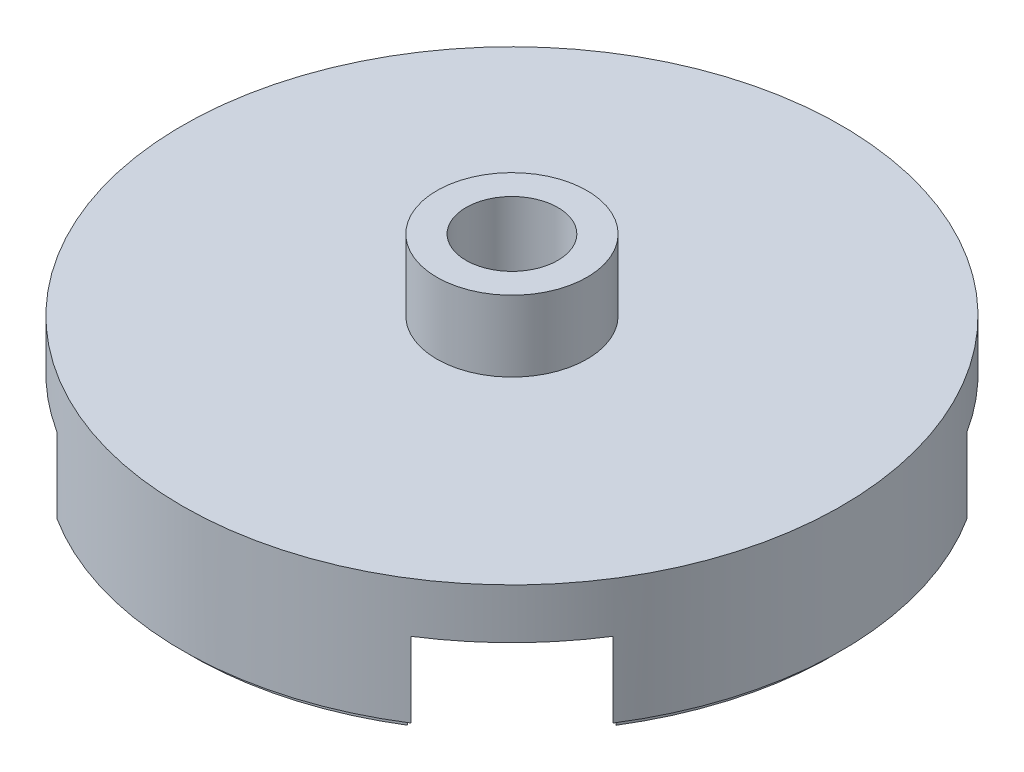
ISO-10303-21;
HEADER;
FILE_DESCRIPTION(('STEP AP214'),'2;1');
FILE_NAME('part.step','',(''),(''),'','','');
FILE_SCHEMA(('AUTOMOTIVE_DESIGN { 1 0 10303 214 1 1 1 1 }'));
ENDSEC;
DATA;
#1=APPLICATION_CONTEXT('core data for automotive mechanical design processes');
#2=APPLICATION_PROTOCOL_DEFINITION('international standard','automotive_design',2000,#1);
#3=PRODUCT_CONTEXT('',#1,'mechanical');
#4=PRODUCT('Part','Part','',(#3));
#5=PRODUCT_RELATED_PRODUCT_CATEGORY('part','',(#4));
#6=PRODUCT_DEFINITION_FORMATION('','',#4);
#7=PRODUCT_DEFINITION_CONTEXT('part definition',#1,'design');
#8=PRODUCT_DEFINITION('design','',#6,#7);
#9=PRODUCT_DEFINITION_SHAPE('','',#8);
#10=(LENGTH_UNIT() NAMED_UNIT(*) SI_UNIT(.MILLI.,.METRE.));
#11=(NAMED_UNIT(*) PLANE_ANGLE_UNIT() SI_UNIT($,.RADIAN.));
#12=(NAMED_UNIT(*) SI_UNIT($,.STERADIAN.) SOLID_ANGLE_UNIT());
#13=UNCERTAINTY_MEASURE_WITH_UNIT(LENGTH_MEASURE(1.E-05),#10,'distance_accuracy_value','');
#14=(GEOMETRIC_REPRESENTATION_CONTEXT(3) GLOBAL_UNCERTAINTY_ASSIGNED_CONTEXT((#13)) GLOBAL_UNIT_ASSIGNED_CONTEXT((#10,
#11,#12)) REPRESENTATION_CONTEXT('',''));
#15=CARTESIAN_POINT('',(0.,0.,0.));
#16=DIRECTION('',(0.,0.,1.));
#17=DIRECTION('',(1.,0.,0.));
#18=AXIS2_PLACEMENT_3D('',#15,#16,#17);
#19=CARTESIAN_POINT('',(0.,0.,0.));
#20=DIRECTION('',(0.,1.,0.));
#21=DIRECTION('',(0.,0.,1.));
#22=AXIS2_PLACEMENT_3D('',#19,#20,#21);
#23=PLANE('',#22);
#24=DIRECTION('',(-0.506190088583315,0.,-0.862421935145446));
#25=VECTOR('',#24,1.);
#26=CARTESIAN_POINT('',(6.66279242192183,0.,4.24466690593985));
#27=LINE('',#26,#25);
#28=CARTESIAN_POINT('',(6.66279242192183,0.,4.24466690593985));
#29=VERTEX_POINT('',#28);
#30=CARTESIAN_POINT('',(5.90350728904686,0.,2.95103400322168));
#31=VERTEX_POINT('',#30);
#32=EDGE_CURVE('E225',#29,#31,#27,.T.);
#33=ORIENTED_EDGE('',*,*,#32,.F.);
#34=CARTESIAN_POINT('',(0.,0.,0.));
#35=DIRECTION('',(0.,1.,0.));
#36=DIRECTION('',(0.,0.,1.));
#37=AXIS2_PLACEMENT_3D('',#34,#35,#36);
#38=CIRCLE('',#37,7.9);
#39=CARTESIAN_POINT('',(4.24466690593992,0.,6.66279242192179));
#40=VERTEX_POINT('',#39);
#41=EDGE_CURVE('E750',#40,#29,#38,.T.);
#42=ORIENTED_EDGE('',*,*,#41,.F.);
#43=DIRECTION('',(0.862421935145451,0.,0.506190088583306));
#44=VECTOR('',#43,1.);
#45=CARTESIAN_POINT('',(4.24466690593992,0.,6.66279242192179));
#46=LINE('',#45,#44);
#47=CARTESIAN_POINT('',(2.95103400322174,0.,5.90350728904683));
#48=VERTEX_POINT('',#47);
#49=EDGE_CURVE('E288',#48,#40,#46,.T.);
#50=ORIENTED_EDGE('',*,*,#49,.F.);
#51=CARTESIAN_POINT('',(0.,0.,0.));
#52=DIRECTION('',(0.,1.,0.));
#53=DIRECTION('',(0.,0.,-1.));
#54=AXIS2_PLACEMENT_3D('',#51,#52,#53);
#55=CIRCLE('',#54,6.6);
#56=CARTESIAN_POINT('',(-2.95103400322174,0.,5.90350728904683));
#57=VERTEX_POINT('',#56);
#58=EDGE_CURVE('E295',#57,#48,#55,.T.);
#59=ORIENTED_EDGE('',*,*,#58,.F.);
#60=DIRECTION('',(0.862421935145451,0.,-0.506190088583306));
#61=VECTOR('',#60,1.);
#62=CARTESIAN_POINT('',(-4.24466690593992,0.,6.66279242192179));
#63=LINE('',#62,#61);
#64=CARTESIAN_POINT('',(-4.24466690593992,0.,6.66279242192179));
#65=VERTEX_POINT('',#64);
#66=EDGE_CURVE('E284',#65,#57,#63,.T.);
#67=ORIENTED_EDGE('',*,*,#66,.F.);
#68=CARTESIAN_POINT('',(-6.66279242192178,0.,4.24466690593994));
#69=VERTEX_POINT('',#68);
#70=EDGE_CURVE('E385',#69,#65,#38,.T.);
#71=ORIENTED_EDGE('',*,*,#70,.F.);
#72=DIRECTION('',(-0.506190088583303,0.,0.862421935145453));
#73=VECTOR('',#72,1.);
#74=CARTESIAN_POINT('',(-6.66279242192178,0.,4.24466690593994));
#75=LINE('',#74,#73);
#76=CARTESIAN_POINT('',(-5.90350728904682,0.,2.95103400322176));
#77=VERTEX_POINT('',#76);
#78=EDGE_CURVE('E312',#77,#69,#75,.T.);
#79=ORIENTED_EDGE('',*,*,#78,.F.);
#80=CARTESIAN_POINT('',(0.,0.,0.));
#81=DIRECTION('',(0.,1.,0.));
#82=DIRECTION('',(1.,0.,0.));
#83=AXIS2_PLACEMENT_3D('',#80,#81,#82);
#84=CIRCLE('',#83,6.6);
#85=CARTESIAN_POINT('',(-5.90350728904684,0.,-2.95103400322172));
#86=VERTEX_POINT('',#85);
#87=EDGE_CURVE('E317',#86,#77,#84,.T.);
#88=ORIENTED_EDGE('',*,*,#87,.F.);
#89=DIRECTION('',(0.506190088583309,0.,0.86242193514545));
#90=VECTOR('',#89,1.);
#91=CARTESIAN_POINT('',(-6.6627924219218,0.,-4.24466690593989));
#92=LINE('',#91,#90);
#93=CARTESIAN_POINT('',(-6.6627924219218,0.,-4.24466690593989));
#94=VERTEX_POINT('',#93);
#95=EDGE_CURVE('E308',#94,#86,#92,.T.);
#96=ORIENTED_EDGE('',*,*,#95,.F.);
#97=CARTESIAN_POINT('',(-4.24466690593992,0.,-6.66279242192179));
#98=VERTEX_POINT('',#97);
#99=EDGE_CURVE('E383',#98,#94,#38,.T.);
#100=ORIENTED_EDGE('',*,*,#99,.F.);
#101=DIRECTION('',(-0.862421935145451,0.,-0.506190088583306));
#102=VECTOR('',#101,1.);
#103=CARTESIAN_POINT('',(-4.24466690593992,0.,-6.66279242192179));
#104=LINE('',#103,#102);
#105=CARTESIAN_POINT('',(-2.95103400322174,0.,-5.90350728904683));
#106=VERTEX_POINT('',#105);
#107=EDGE_CURVE('E350',#106,#98,#104,.T.);
#108=ORIENTED_EDGE('',*,*,#107,.F.);
#109=CARTESIAN_POINT('',(0.,0.,0.));
#110=DIRECTION('',(0.,1.,0.));
#111=DIRECTION('',(0.,0.,1.));
#112=AXIS2_PLACEMENT_3D('',#109,#110,#111);
#113=CIRCLE('',#112,6.6);
#114=CARTESIAN_POINT('',(2.95103400322174,0.,-5.90350728904683));
#115=VERTEX_POINT('',#114);
#116=EDGE_CURVE('E358',#115,#106,#113,.T.);
#117=ORIENTED_EDGE('',*,*,#116,.F.);
#118=DIRECTION('',(-0.862421935145451,0.,0.506190088583306));
#119=VECTOR('',#118,1.);
#120=CARTESIAN_POINT('',(4.24466690593992,0.,-6.66279242192179));
#121=LINE('',#120,#119);
#122=CARTESIAN_POINT('',(4.24466690593992,0.,-6.66279242192179));
#123=VERTEX_POINT('',#122);
#124=EDGE_CURVE('E344',#123,#115,#121,.T.);
#125=ORIENTED_EDGE('',*,*,#124,.F.);
#126=CARTESIAN_POINT('',(6.66279242192175,0.,-4.24466690593999));
#127=VERTEX_POINT('',#126);
#128=EDGE_CURVE('E377',#127,#123,#38,.T.);
#129=ORIENTED_EDGE('',*,*,#128,.F.);
#130=DIRECTION('',(0.506190088583297,0.,-0.862421935145457));
#131=VECTOR('',#130,1.);
#132=CARTESIAN_POINT('',(6.66279242192175,0.,-4.24466690593999));
#133=LINE('',#132,#131);
#134=CARTESIAN_POINT('',(5.9035072890468,0.,-2.9510340032218));
#135=VERTEX_POINT('',#134);
#136=EDGE_CURVE('E264',#135,#127,#133,.T.);
#137=ORIENTED_EDGE('',*,*,#136,.F.);
#138=CARTESIAN_POINT('',(0.,0.,0.));
#139=DIRECTION('',(0.,1.,0.));
#140=DIRECTION('',(-1.,0.,0.));
#141=AXIS2_PLACEMENT_3D('',#138,#139,#140);
#142=CIRCLE('',#141,6.6);
#143=EDGE_CURVE('E271',#31,#135,#142,.T.);
#144=ORIENTED_EDGE('',*,*,#143,.F.);
#145=EDGE_LOOP('',(#33,#42,#50,#59,#67,#71,#79,#88,#96,#100,#108,#117,#125,#129,#137,#144));
#146=FACE_BOUND('',#145,.T.);
#147=CARTESIAN_POINT('',(0.,0.,0.));
#148=DIRECTION('',(0.,1.,0.));
#149=DIRECTION('',(0.,0.,1.));
#150=AXIS2_PLACEMENT_3D('',#147,#148,#149);
#151=CIRCLE('',#150,1.7);
#152=CARTESIAN_POINT('',(0.,0.,1.7));
#153=VERTEX_POINT('',#152);
#154=EDGE_CURVE('E11',#153,#153,#151,.F.);
#155=ORIENTED_EDGE('',*,*,#154,.F.);
#156=EDGE_LOOP('',(#155));
#157=FACE_BOUND('',#156,.T.);
#158=ADVANCED_FACE('F37',(#146,#157),#23,.F.);
#159=CARTESIAN_POINT('',(0.,1.2,0.));
#160=DIRECTION('',(0.,-1.,0.));
#161=DIRECTION('',(0.,0.,-1.));
#162=AXIS2_PLACEMENT_3D('',#159,#160,#161);
#163=CYLINDRICAL_SURFACE('',#162,7.9);
#164=CARTESIAN_POINT('',(0.,1.2,0.));
#165=DIRECTION('',(0.,1.,0.));
#166=DIRECTION('',(0.,0.,1.));
#167=AXIS2_PLACEMENT_3D('',#164,#165,#166);
#168=CIRCLE('',#167,7.9);
#169=CARTESIAN_POINT('',(0.,1.2,7.9));
#170=VERTEX_POINT('',#169);
#171=EDGE_CURVE('E380',#170,#170,#168,.T.);
#172=ORIENTED_EDGE('',*,*,#171,.F.);
#173=EDGE_LOOP('',(#172));
#174=FACE_BOUND('',#173,.T.);
#175=DIRECTION('',(0.,1.,0.));
#176=VECTOR('',#175,1.);
#177=CARTESIAN_POINT('',(-6.6627924219218,-2.,-4.24466690593989));
#178=LINE('',#177,#176);
#179=CARTESIAN_POINT('',(-6.6627924219218,-1.8,-4.2446669059399));
#180=VERTEX_POINT('',#179);
#181=EDGE_CURVE('E327',#180,#94,#178,.T.);
#182=ORIENTED_EDGE('',*,*,#181,.F.);
#183=CARTESIAN_POINT('',(0.,-1.8,0.));
#184=DIRECTION('',(0.,-1.,0.));
#185=DIRECTION('',(-1.,0.,0.));
#186=AXIS2_PLACEMENT_3D('',#183,#184,#185);
#187=CIRCLE('',#186,7.9);
#188=CARTESIAN_POINT('',(-6.66279242192177,-1.8,4.24466690593995));
#189=VERTEX_POINT('',#188);
#190=EDGE_CURVE('E218',#189,#180,#187,.T.);
#191=ORIENTED_EDGE('',*,*,#190,.F.);
#192=DIRECTION('',(0.,1.,0.));
#193=VECTOR('',#192,1.);
#194=CARTESIAN_POINT('',(-6.66279242192178,-2.,4.24466690593994));
#195=LINE('',#194,#193);
#196=EDGE_CURVE('E217',#189,#69,#195,.T.);
#197=ORIENTED_EDGE('',*,*,#196,.T.);
#198=ORIENTED_EDGE('',*,*,#70,.T.);
#199=DIRECTION('',(0.,1.,0.));
#200=VECTOR('',#199,1.);
#201=CARTESIAN_POINT('',(-4.24466690593992,-2.,6.66279242192179));
#202=LINE('',#201,#200);
#203=CARTESIAN_POINT('',(-4.24466690593992,-1.8,6.66279242192179));
#204=VERTEX_POINT('',#203);
#205=EDGE_CURVE('E306',#204,#65,#202,.T.);
#206=ORIENTED_EDGE('',*,*,#205,.F.);
#207=CARTESIAN_POINT('',(0.,-1.8,0.));
#208=DIRECTION('',(0.,-1.,0.));
#209=DIRECTION('',(0.,0.,1.));
#210=AXIS2_PLACEMENT_3D('',#207,#208,#209);
#211=CIRCLE('',#210,7.9);
#212=CARTESIAN_POINT('',(4.24466690593992,-1.8,6.66279242192179));
#213=VERTEX_POINT('',#212);
#214=EDGE_CURVE('E233',#213,#204,#211,.T.);
#215=ORIENTED_EDGE('',*,*,#214,.F.);
#216=DIRECTION('',(0.,1.,0.));
#217=VECTOR('',#216,1.);
#218=CARTESIAN_POINT('',(4.24466690593992,-2.,6.66279242192179));
#219=LINE('',#218,#217);
#220=EDGE_CURVE('E293',#213,#40,#219,.T.);
#221=ORIENTED_EDGE('',*,*,#220,.T.);
#222=ORIENTED_EDGE('',*,*,#41,.T.);
#223=DIRECTION('',(0.,1.,0.));
#224=VECTOR('',#223,1.);
#225=CARTESIAN_POINT('',(6.66279242192183,-2.,4.24466690593985));
#226=LINE('',#225,#224);
#227=CARTESIAN_POINT('',(6.66279242192183,-1.8,4.24466690593985));
#228=VERTEX_POINT('',#227);
#229=EDGE_CURVE('E282',#228,#29,#226,.T.);
#230=ORIENTED_EDGE('',*,*,#229,.F.);
#231=CARTESIAN_POINT('',(0.,-1.8,0.));
#232=DIRECTION('',(0.,-1.,0.));
#233=DIRECTION('',(1.,0.,0.));
#234=AXIS2_PLACEMENT_3D('',#231,#232,#233);
#235=CIRCLE('',#234,7.9);
#236=CARTESIAN_POINT('',(6.66279242192174,-1.8,-4.24466690593999));
#237=VERTEX_POINT('',#236);
#238=EDGE_CURVE('E250',#237,#228,#235,.T.);
#239=ORIENTED_EDGE('',*,*,#238,.F.);
#240=DIRECTION('',(0.,1.,0.));
#241=VECTOR('',#240,1.);
#242=CARTESIAN_POINT('',(6.66279242192175,-2.,-4.24466690593999));
#243=LINE('',#242,#241);
#244=EDGE_CURVE('E269',#237,#127,#243,.T.);
#245=ORIENTED_EDGE('',*,*,#244,.T.);
#246=ORIENTED_EDGE('',*,*,#128,.T.);
#247=DIRECTION('',(0.,1.,0.));
#248=VECTOR('',#247,1.);
#249=CARTESIAN_POINT('',(4.24466690593992,-2.,-6.66279242192179));
#250=LINE('',#249,#248);
#251=CARTESIAN_POINT('',(4.24466690593992,-1.8,-6.66279242192179));
#252=VERTEX_POINT('',#251);
#253=EDGE_CURVE('E370',#252,#123,#250,.T.);
#254=ORIENTED_EDGE('',*,*,#253,.F.);
#255=CARTESIAN_POINT('',(0.,-1.8,0.));
#256=DIRECTION('',(0.,-1.,0.));
#257=DIRECTION('',(0.,0.,-1.));
#258=AXIS2_PLACEMENT_3D('',#255,#256,#257);
#259=CIRCLE('',#258,7.9);
#260=CARTESIAN_POINT('',(-4.24466690593992,-1.8,-6.66279242192179));
#261=VERTEX_POINT('',#260);
#262=EDGE_CURVE('E335',#261,#252,#259,.T.);
#263=ORIENTED_EDGE('',*,*,#262,.F.);
#264=DIRECTION('',(0.,1.,0.));
#265=VECTOR('',#264,1.);
#266=CARTESIAN_POINT('',(-4.24466690593992,-2.,-6.66279242192179));
#267=LINE('',#266,#265);
#268=EDGE_CURVE('E355',#261,#98,#267,.T.);
#269=ORIENTED_EDGE('',*,*,#268,.T.);
#270=ORIENTED_EDGE('',*,*,#99,.T.);
#271=EDGE_LOOP('',(#182,#191,#197,#198,#206,#215,#221,#222,#230,#239,#245,#246,#254,#263,#269,#270));
#272=FACE_BOUND('',#271,.T.);
#273=ADVANCED_FACE('F39',(#174,#272),#163,.T.);
#274=CARTESIAN_POINT('',(0.,1.2,0.));
#275=DIRECTION('',(0.,1.,0.));
#276=DIRECTION('',(0.,0.,1.));
#277=AXIS2_PLACEMENT_3D('',#274,#275,#276);
#278=PLANE('',#277);
#279=CARTESIAN_POINT('',(0.,1.2,0.));
#280=DIRECTION('',(0.,1.,0.));
#281=DIRECTION('',(0.,0.,1.));
#282=AXIS2_PLACEMENT_3D('',#279,#280,#281);
#283=CIRCLE('',#282,1.8);
#284=CARTESIAN_POINT('',(0.,1.2,1.8));
#285=VERTEX_POINT('',#284);
#286=EDGE_CURVE('E45',#285,#285,#283,.T.);
#287=ORIENTED_EDGE('',*,*,#286,.F.);
#288=EDGE_LOOP('',(#287));
#289=FACE_BOUND('',#288,.T.);
#290=ORIENTED_EDGE('',*,*,#171,.T.);
#291=EDGE_LOOP('',(#290));
#292=FACE_BOUND('',#291,.T.);
#293=ADVANCED_FACE('F401',(#289,#292),#278,.T.);
#294=CARTESIAN_POINT('',(0.,2.9,0.));
#295=DIRECTION('',(0.,-1.,0.));
#296=DIRECTION('',(0.,0.,-1.));
#297=AXIS2_PLACEMENT_3D('',#294,#295,#296);
#298=CYLINDRICAL_SURFACE('',#297,1.8);
#299=CARTESIAN_POINT('',(0.,2.9,0.));
#300=DIRECTION('',(0.,1.,0.));
#301=DIRECTION('',(0.,0.,1.));
#302=AXIS2_PLACEMENT_3D('',#299,#300,#301);
#303=CIRCLE('',#302,1.8);
#304=CARTESIAN_POINT('',(0.,2.9,1.8));
#305=VERTEX_POINT('',#304);
#306=EDGE_CURVE('E374',#305,#305,#303,.T.);
#307=ORIENTED_EDGE('',*,*,#306,.F.);
#308=EDGE_LOOP('',(#307));
#309=FACE_BOUND('',#308,.T.);
#310=ORIENTED_EDGE('',*,*,#286,.T.);
#311=EDGE_LOOP('',(#310));
#312=FACE_BOUND('',#311,.T.);
#313=ADVANCED_FACE('F395',(#309,#312),#298,.T.);
#314=CARTESIAN_POINT('',(0.,2.9,0.));
#315=DIRECTION('',(0.,1.,0.));
#316=DIRECTION('',(0.,0.,1.));
#317=AXIS2_PLACEMENT_3D('',#314,#315,#316);
#318=PLANE('',#317);
#319=CARTESIAN_POINT('',(0.,2.9,0.));
#320=DIRECTION('',(0.,1.,0.));
#321=DIRECTION('',(0.,0.,1.));
#322=AXIS2_PLACEMENT_3D('',#319,#320,#321);
#323=CIRCLE('',#322,1.1);
#324=CARTESIAN_POINT('',(0.,2.9,1.1));
#325=VERTEX_POINT('',#324);
#326=EDGE_CURVE('E373',#325,#325,#323,.T.);
#327=ORIENTED_EDGE('',*,*,#326,.F.);
#328=EDGE_LOOP('',(#327));
#329=FACE_BOUND('',#328,.T.);
#330=ORIENTED_EDGE('',*,*,#306,.T.);
#331=EDGE_LOOP('',(#330));
#332=FACE_BOUND('',#331,.T.);
#333=ADVANCED_FACE('F392',(#329,#332),#318,.T.);
#334=CARTESIAN_POINT('',(0.,0.,0.));
#335=DIRECTION('',(0.,1.,0.));
#336=DIRECTION('',(0.,0.,1.));
#337=AXIS2_PLACEMENT_3D('',#334,#335,#336);
#338=CYLINDRICAL_SURFACE('',#337,1.1);
#339=ORIENTED_EDGE('',*,*,#326,.T.);
#340=EDGE_LOOP('',(#339));
#341=FACE_BOUND('',#340,.T.);
#342=CARTESIAN_POINT('',(0.,-2.,0.));
#343=DIRECTION('',(0.,-1.,0.));
#344=DIRECTION('',(0.,0.,-1.));
#345=AXIS2_PLACEMENT_3D('',#342,#343,#344);
#346=CIRCLE('',#345,1.1);
#347=CARTESIAN_POINT('',(0.,-2.,-1.1));
#348=VERTEX_POINT('',#347);
#349=EDGE_CURVE('E656',#348,#348,#346,.T.);
#350=ORIENTED_EDGE('',*,*,#349,.T.);
#351=EDGE_LOOP('',(#350));
#352=FACE_BOUND('',#351,.T.);
#353=ADVANCED_FACE('F389',(#341,#352),#338,.F.);
#354=CARTESIAN_POINT('',(4.24466690593992,-2.,-6.66279242192179));
#355=DIRECTION('',(-0.506190088583306,0.,-0.862421935145452));
#356=DIRECTION('',(-0.862421935145452,0.,0.506190088583306));
#357=AXIS2_PLACEMENT_3D('',#354,#355,#356);
#358=PLANE('',#357);
#359=DIRECTION('',(-0.862421935145451,0.,0.506190088583306));
#360=VECTOR('',#359,1.);
#361=CARTESIAN_POINT('',(4.24466690593992,-2.,-6.66279242192179));
#362=LINE('',#361,#360);
#363=CARTESIAN_POINT('',(4.05026569607206,-2.,-6.54869054019366));
#364=VERTEX_POINT('',#363);
#365=CARTESIAN_POINT('',(2.95103400322174,-2.,-5.90350728904683));
#366=VERTEX_POINT('',#365);
#367=EDGE_CURVE('E347',#364,#366,#362,.T.);
#368=ORIENTED_EDGE('',*,*,#367,.F.);
#369=DIRECTION('',(0.,-1.,0.));
#370=VECTOR('',#369,1.);
#371=CARTESIAN_POINT('',(4.05026569607206,-1.8,-6.54869054019366));
#372=LINE('',#371,#370);
#373=CARTESIAN_POINT('',(4.05026569607206,-1.8,-6.54869054019366));
#374=VERTEX_POINT('',#373);
#375=EDGE_CURVE('E342',#374,#364,#372,.T.);
#376=ORIENTED_EDGE('',*,*,#375,.F.);
#377=DIRECTION('',(-0.862421935145456,0.,0.506190088583297));
#378=VECTOR('',#377,1.);
#379=CARTESIAN_POINT('',(4.24466690593992,-1.8,-6.66279242192179));
#380=LINE('',#379,#378);
#381=EDGE_CURVE('E337',#252,#374,#380,.T.);
#382=ORIENTED_EDGE('',*,*,#381,.F.);
#383=ORIENTED_EDGE('',*,*,#253,.T.);
#384=ORIENTED_EDGE('',*,*,#124,.T.);
#385=DIRECTION('',(0.,1.,0.));
#386=VECTOR('',#385,1.);
#387=CARTESIAN_POINT('',(2.95103400322174,-2.,-5.90350728904683));
#388=LINE('',#387,#386);
#389=EDGE_CURVE('E367',#366,#115,#388,.T.);
#390=ORIENTED_EDGE('',*,*,#389,.F.);
#391=EDGE_LOOP('',(#368,#376,#382,#383,#384,#390));
#392=FACE_BOUND('',#391,.T.);
#393=ADVANCED_FACE('F448',(#392),#358,.F.);
#394=CARTESIAN_POINT('',(0.,-2.,0.));
#395=DIRECTION('',(0.,1.,0.));
#396=DIRECTION('',(0.,0.,1.));
#397=AXIS2_PLACEMENT_3D('',#394,#395,#396);
#398=CYLINDRICAL_SURFACE('',#397,6.6);
#399=ORIENTED_EDGE('',*,*,#116,.T.);
#400=DIRECTION('',(0.,1.,0.));
#401=VECTOR('',#400,1.);
#402=CARTESIAN_POINT('',(-2.95103400322174,-2.,-5.90350728904683));
#403=LINE('',#402,#401);
#404=CARTESIAN_POINT('',(-2.95103400322174,-2.,-5.90350728904683));
#405=VERTEX_POINT('',#404);
#406=EDGE_CURVE('E364',#405,#106,#403,.T.);
#407=ORIENTED_EDGE('',*,*,#406,.F.);
#408=CARTESIAN_POINT('',(0.,-2.,0.));
#409=DIRECTION('',(0.,1.,0.));
#410=DIRECTION('',(0.,0.,1.));
#411=AXIS2_PLACEMENT_3D('',#408,#409,#410);
#412=CIRCLE('',#411,6.6);
#413=EDGE_CURVE('E349',#366,#405,#412,.T.);
#414=ORIENTED_EDGE('',*,*,#413,.F.);
#415=ORIENTED_EDGE('',*,*,#389,.T.);
#416=EDGE_LOOP('',(#399,#407,#414,#415));
#417=FACE_BOUND('',#416,.T.);
#418=ADVANCED_FACE('F451',(#417),#398,.F.);
#419=CARTESIAN_POINT('',(-4.24466690593992,-2.,-6.66279242192179));
#420=DIRECTION('',(0.506190088583306,0.,-0.862421935145452));
#421=DIRECTION('',(-0.862421935145452,0.,-0.506190088583306));
#422=AXIS2_PLACEMENT_3D('',#419,#420,#421);
#423=PLANE('',#422);
#424=DIRECTION('',(-0.862421935145465,0.,-0.506190088583283));
#425=VECTOR('',#424,1.);
#426=CARTESIAN_POINT('',(-4.05026569607206,-1.8,-6.54869054019366));
#427=LINE('',#426,#425);
#428=CARTESIAN_POINT('',(-4.05026569607206,-1.8,-6.54869054019366));
#429=VERTEX_POINT('',#428);
#430=EDGE_CURVE('E333',#429,#261,#427,.T.);
#431=ORIENTED_EDGE('',*,*,#430,.F.);
#432=DIRECTION('',(0.,-1.,0.));
#433=VECTOR('',#432,1.);
#434=CARTESIAN_POINT('',(-4.05026569607206,-1.8,-6.54869054019366));
#435=LINE('',#434,#433);
#436=CARTESIAN_POINT('',(-4.05026569607206,-2.,-6.54869054019366));
#437=VERTEX_POINT('',#436);
#438=EDGE_CURVE('E340',#429,#437,#435,.T.);
#439=ORIENTED_EDGE('',*,*,#438,.T.);
#440=DIRECTION('',(-0.862421935145451,0.,-0.506190088583306));
#441=VECTOR('',#440,1.);
#442=CARTESIAN_POINT('',(-4.24466690593992,-2.,-6.66279242192179));
#443=LINE('',#442,#441);
#444=EDGE_CURVE('E352',#405,#437,#443,.T.);
#445=ORIENTED_EDGE('',*,*,#444,.F.);
#446=ORIENTED_EDGE('',*,*,#406,.T.);
#447=ORIENTED_EDGE('',*,*,#107,.T.);
#448=ORIENTED_EDGE('',*,*,#268,.F.);
#449=EDGE_LOOP('',(#431,#439,#445,#446,#447,#448));
#450=FACE_BOUND('',#449,.T.);
#451=ADVANCED_FACE('F455',(#450),#423,.F.);
#452=CARTESIAN_POINT('',(0.,-2.,0.));
#453=DIRECTION('',(0.,1.,0.));
#454=DIRECTION('',(0.,0.,1.));
#455=AXIS2_PLACEMENT_3D('',#452,#453,#454);
#456=PLANE('',#455);
#457=ORIENTED_EDGE('',*,*,#444,.T.);
#458=CARTESIAN_POINT('',(0.,-2.,0.));
#459=DIRECTION('',(0.,1.,0.));
#460=DIRECTION('',(0.,0.,1.));
#461=AXIS2_PLACEMENT_3D('',#458,#459,#460);
#462=CIRCLE('',#461,7.7);
#463=EDGE_CURVE('E329',#364,#437,#462,.T.);
#464=ORIENTED_EDGE('',*,*,#463,.F.);
#465=ORIENTED_EDGE('',*,*,#367,.T.);
#466=ORIENTED_EDGE('',*,*,#413,.T.);
#467=EDGE_LOOP('',(#457,#464,#465,#466));
#468=FACE_BOUND('',#467,.T.);
#469=ADVANCED_FACE('F459',(#468),#456,.F.);
#470=CARTESIAN_POINT('',(0.,-1.8,0.));
#471=DIRECTION('',(0.,-1.,0.));
#472=DIRECTION('',(0.,0.,-1.));
#473=AXIS2_PLACEMENT_3D('',#470,#471,#472);
#474=CYLINDRICAL_SURFACE('',#473,7.7);
#475=ORIENTED_EDGE('',*,*,#463,.T.);
#476=ORIENTED_EDGE('',*,*,#438,.F.);
#477=CARTESIAN_POINT('',(0.,-1.8,0.));
#478=DIRECTION('',(0.,1.,0.));
#479=DIRECTION('',(0.,0.,1.));
#480=AXIS2_PLACEMENT_3D('',#477,#478,#479);
#481=CIRCLE('',#480,7.7);
#482=EDGE_CURVE('E330',#374,#429,#481,.T.);
#483=ORIENTED_EDGE('',*,*,#482,.F.);
#484=ORIENTED_EDGE('',*,*,#375,.T.);
#485=EDGE_LOOP('',(#475,#476,#483,#484));
#486=FACE_BOUND('',#485,.T.);
#487=ADVANCED_FACE('F463',(#486),#474,.T.);
#488=CARTESIAN_POINT('',(0.,-1.8,0.));
#489=DIRECTION('',(0.,1.,0.));
#490=DIRECTION('',(0.,0.,1.));
#491=AXIS2_PLACEMENT_3D('',#488,#489,#490);
#492=PLANE('',#491);
#493=ORIENTED_EDGE('',*,*,#482,.T.);
#494=ORIENTED_EDGE('',*,*,#430,.T.);
#495=ORIENTED_EDGE('',*,*,#262,.T.);
#496=ORIENTED_EDGE('',*,*,#381,.T.);
#497=EDGE_LOOP('',(#493,#494,#495,#496));
#498=FACE_BOUND('',#497,.T.);
#499=ADVANCED_FACE('F467',(#498),#492,.F.);
#500=CARTESIAN_POINT('',(-6.6627924219218,-2.,-4.24466690593989));
#501=DIRECTION('',(-0.86242193514545,0.,0.506190088583309));
#502=DIRECTION('',(0.506190088583309,0.,0.86242193514545));
#503=AXIS2_PLACEMENT_3D('',#500,#501,#502);
#504=PLANE('',#503);
#505=DIRECTION('',(0.506190088583309,0.,0.86242193514545));
#506=VECTOR('',#505,1.);
#507=CARTESIAN_POINT('',(-6.6627924219218,-2.,-4.24466690593989));
#508=LINE('',#507,#506);
#509=CARTESIAN_POINT('',(-6.54869054019367,-2.,-4.05026569607204));
#510=VERTEX_POINT('',#509);
#511=CARTESIAN_POINT('',(-5.90350728904684,-2.,-2.95103400322172));
#512=VERTEX_POINT('',#511);
#513=EDGE_CURVE('E309',#510,#512,#508,.T.);
#514=ORIENTED_EDGE('',*,*,#513,.F.);
#515=DIRECTION('',(0.,-1.,0.));
#516=VECTOR('',#515,1.);
#517=CARTESIAN_POINT('',(-6.54869054019367,-1.8,-4.05026569607204));
#518=LINE('',#517,#516);
#519=CARTESIAN_POINT('',(-6.54869054019367,-1.8,-4.05026569607204));
#520=VERTEX_POINT('',#519);
#521=EDGE_CURVE('E52',#520,#510,#518,.T.);
#522=ORIENTED_EDGE('',*,*,#521,.F.);
#523=DIRECTION('',(0.5061900885833,0.,0.862421935145455));
#524=VECTOR('',#523,1.);
#525=CARTESIAN_POINT('',(-6.6627924219218,-1.8,-4.2446669059399));
#526=LINE('',#525,#524);
#527=EDGE_CURVE('E206',#180,#520,#526,.T.);
#528=ORIENTED_EDGE('',*,*,#527,.F.);
#529=ORIENTED_EDGE('',*,*,#181,.T.);
#530=ORIENTED_EDGE('',*,*,#95,.T.);
#531=DIRECTION('',(0.,1.,0.));
#532=VECTOR('',#531,1.);
#533=CARTESIAN_POINT('',(-5.90350728904684,-2.,-2.95103400322172));
#534=LINE('',#533,#532);
#535=EDGE_CURVE('E324',#512,#86,#534,.T.);
#536=ORIENTED_EDGE('',*,*,#535,.F.);
#537=EDGE_LOOP('',(#514,#522,#528,#529,#530,#536));
#538=FACE_BOUND('',#537,.T.);
#539=ADVANCED_FACE('F417',(#538),#504,.F.);
#540=CARTESIAN_POINT('',(0.,-2.,0.));
#541=DIRECTION('',(0.,1.,0.));
#542=DIRECTION('',(0.,0.,1.));
#543=AXIS2_PLACEMENT_3D('',#540,#541,#542);
#544=CYLINDRICAL_SURFACE('',#543,6.6);
#545=ORIENTED_EDGE('',*,*,#87,.T.);
#546=DIRECTION('',(0.,1.,0.));
#547=VECTOR('',#546,1.);
#548=CARTESIAN_POINT('',(-5.90350728904682,-2.,2.95103400322176));
#549=LINE('',#548,#547);
#550=CARTESIAN_POINT('',(-5.90350728904682,-2.,2.95103400322176));
#551=VERTEX_POINT('',#550);
#552=EDGE_CURVE('E321',#551,#77,#549,.T.);
#553=ORIENTED_EDGE('',*,*,#552,.F.);
#554=CARTESIAN_POINT('',(0.,-2.,0.));
#555=DIRECTION('',(0.,1.,0.));
#556=DIRECTION('',(1.,0.,0.));
#557=AXIS2_PLACEMENT_3D('',#554,#555,#556);
#558=CIRCLE('',#557,6.6);
#559=EDGE_CURVE('E311',#512,#551,#558,.T.);
#560=ORIENTED_EDGE('',*,*,#559,.F.);
#561=ORIENTED_EDGE('',*,*,#535,.T.);
#562=EDGE_LOOP('',(#545,#553,#560,#561));
#563=FACE_BOUND('',#562,.T.);
#564=ADVANCED_FACE('F427',(#563),#544,.F.);
#565=CARTESIAN_POINT('',(-6.66279242192178,-2.,4.24466690593994));
#566=DIRECTION('',(-0.862421935145453,0.,-0.506190088583303));
#567=DIRECTION('',(-0.506190088583303,0.,0.862421935145453));
#568=AXIS2_PLACEMENT_3D('',#565,#566,#567);
#569=PLANE('',#568);
#570=DIRECTION('',(-0.50619008858328,0.,0.862421935145467));
#571=VECTOR('',#570,1.);
#572=CARTESIAN_POINT('',(-6.54869054019364,-1.8,4.05026569607208));
#573=LINE('',#572,#571);
#574=CARTESIAN_POINT('',(-6.54869054019364,-1.8,4.05026569607208));
#575=VERTEX_POINT('',#574);
#576=EDGE_CURVE('E210',#575,#189,#573,.T.);
#577=ORIENTED_EDGE('',*,*,#576,.F.);
#578=DIRECTION('',(0.,-1.,0.));
#579=VECTOR('',#578,1.);
#580=CARTESIAN_POINT('',(-6.54869054019364,-1.8,4.05026569607208));
#581=LINE('',#580,#579);
#582=CARTESIAN_POINT('',(-6.54869054019364,-2.,4.05026569607208));
#583=VERTEX_POINT('',#582);
#584=EDGE_CURVE('E196',#575,#583,#581,.T.);
#585=ORIENTED_EDGE('',*,*,#584,.T.);
#586=DIRECTION('',(-0.506190088583303,0.,0.862421935145453));
#587=VECTOR('',#586,1.);
#588=CARTESIAN_POINT('',(-6.66279242192178,-2.,4.24466690593994));
#589=LINE('',#588,#587);
#590=EDGE_CURVE('E314',#551,#583,#589,.T.);
#591=ORIENTED_EDGE('',*,*,#590,.F.);
#592=ORIENTED_EDGE('',*,*,#552,.T.);
#593=ORIENTED_EDGE('',*,*,#78,.T.);
#594=ORIENTED_EDGE('',*,*,#196,.F.);
#595=EDGE_LOOP('',(#577,#585,#591,#592,#593,#594));
#596=FACE_BOUND('',#595,.T.);
#597=ADVANCED_FACE('F215',(#596),#569,.F.);
#598=CARTESIAN_POINT('',(0.,-2.,0.));
#599=DIRECTION('',(0.,1.,0.));
#600=DIRECTION('',(1.,0.,0.));
#601=AXIS2_PLACEMENT_3D('',#598,#599,#600);
#602=PLANE('',#601);
#603=ORIENTED_EDGE('',*,*,#590,.T.);
#604=CARTESIAN_POINT('',(0.,-2.,0.));
#605=DIRECTION('',(0.,1.,0.));
#606=DIRECTION('',(1.,0.,0.));
#607=AXIS2_PLACEMENT_3D('',#604,#605,#606);
#608=CIRCLE('',#607,7.7);
#609=EDGE_CURVE('E201',#510,#583,#608,.T.);
#610=ORIENTED_EDGE('',*,*,#609,.F.);
#611=ORIENTED_EDGE('',*,*,#513,.T.);
#612=ORIENTED_EDGE('',*,*,#559,.T.);
#613=EDGE_LOOP('',(#603,#610,#611,#612));
#614=FACE_BOUND('',#613,.T.);
#615=ADVANCED_FACE('F430',(#614),#602,.F.);
#616=CARTESIAN_POINT('',(-4.24466690593992,-2.,6.66279242192179));
#617=DIRECTION('',(0.506190088583306,0.,0.862421935145452));
#618=DIRECTION('',(0.862421935145452,0.,-0.506190088583306));
#619=AXIS2_PLACEMENT_3D('',#616,#617,#618);
#620=PLANE('',#619);
#621=DIRECTION('',(0.862421935145451,0.,-0.506190088583306));
#622=VECTOR('',#621,1.);
#623=CARTESIAN_POINT('',(-4.24466690593992,-2.,6.66279242192179));
#624=LINE('',#623,#622);
#625=CARTESIAN_POINT('',(-4.05026569607206,-2.,6.54869054019366));
#626=VERTEX_POINT('',#625);
#627=CARTESIAN_POINT('',(-2.95103400322174,-2.,5.90350728904683));
#628=VERTEX_POINT('',#627);
#629=EDGE_CURVE('E285',#626,#628,#624,.T.);
#630=ORIENTED_EDGE('',*,*,#629,.F.);
#631=DIRECTION('',(0.,-1.,0.));
#632=VECTOR('',#631,1.);
#633=CARTESIAN_POINT('',(-4.05026569607206,-1.8,6.54869054019366));
#634=LINE('',#633,#632);
#635=CARTESIAN_POINT('',(-4.05026569607206,-1.8,6.54869054019366));
#636=VERTEX_POINT('',#635);
#637=EDGE_CURVE('E60',#636,#626,#634,.T.);
#638=ORIENTED_EDGE('',*,*,#637,.F.);
#639=DIRECTION('',(0.862421935145456,0.,-0.506190088583297));
#640=VECTOR('',#639,1.);
#641=CARTESIAN_POINT('',(-4.24466690593992,-1.8,6.66279242192179));
#642=LINE('',#641,#640);
#643=EDGE_CURVE('E235',#204,#636,#642,.T.);
#644=ORIENTED_EDGE('',*,*,#643,.F.);
#645=ORIENTED_EDGE('',*,*,#205,.T.);
#646=ORIENTED_EDGE('',*,*,#66,.T.);
#647=DIRECTION('',(0.,1.,0.));
#648=VECTOR('',#647,1.);
#649=CARTESIAN_POINT('',(-2.95103400322174,-2.,5.90350728904683));
#650=LINE('',#649,#648);
#651=EDGE_CURVE('E303',#628,#57,#650,.T.);
#652=ORIENTED_EDGE('',*,*,#651,.F.);
#653=EDGE_LOOP('',(#630,#638,#644,#645,#646,#652));
#654=FACE_BOUND('',#653,.T.);
#655=ADVANCED_FACE('F432',(#654),#620,.F.);
#656=CARTESIAN_POINT('',(0.,-2.,0.));
#657=DIRECTION('',(0.,1.,0.));
#658=DIRECTION('',(0.,0.,1.));
#659=AXIS2_PLACEMENT_3D('',#656,#657,#658);
#660=CYLINDRICAL_SURFACE('',#659,6.6);
#661=ORIENTED_EDGE('',*,*,#58,.T.);
#662=DIRECTION('',(0.,1.,0.));
#663=VECTOR('',#662,1.);
#664=CARTESIAN_POINT('',(2.95103400322174,-2.,5.90350728904683));
#665=LINE('',#664,#663);
#666=CARTESIAN_POINT('',(2.95103400322174,-2.,5.90350728904683));
#667=VERTEX_POINT('',#666);
#668=EDGE_CURVE('E300',#667,#48,#665,.T.);
#669=ORIENTED_EDGE('',*,*,#668,.F.);
#670=CARTESIAN_POINT('',(0.,-2.,0.));
#671=DIRECTION('',(0.,1.,0.));
#672=DIRECTION('',(0.,0.,-1.));
#673=AXIS2_PLACEMENT_3D('',#670,#671,#672);
#674=CIRCLE('',#673,6.6);
#675=EDGE_CURVE('E287',#628,#667,#674,.T.);
#676=ORIENTED_EDGE('',*,*,#675,.F.);
#677=ORIENTED_EDGE('',*,*,#651,.T.);
#678=EDGE_LOOP('',(#661,#669,#676,#677));
#679=FACE_BOUND('',#678,.T.);
#680=ADVANCED_FACE('F438',(#679),#660,.F.);
#681=CARTESIAN_POINT('',(4.24466690593992,-2.,6.66279242192179));
#682=DIRECTION('',(-0.506190088583306,0.,0.862421935145452));
#683=DIRECTION('',(0.862421935145452,0.,0.506190088583306));
#684=AXIS2_PLACEMENT_3D('',#681,#682,#683);
#685=PLANE('',#684);
#686=DIRECTION('',(0.862421935145465,0.,0.506190088583283));
#687=VECTOR('',#686,1.);
#688=CARTESIAN_POINT('',(4.05026569607206,-1.8,6.54869054019366));
#689=LINE('',#688,#687);
#690=CARTESIAN_POINT('',(4.05026569607206,-1.8,6.54869054019366));
#691=VERTEX_POINT('',#690);
#692=EDGE_CURVE('E230',#691,#213,#689,.T.);
#693=ORIENTED_EDGE('',*,*,#692,.F.);
#694=DIRECTION('',(0.,-1.,0.));
#695=VECTOR('',#694,1.);
#696=CARTESIAN_POINT('',(4.05026569607206,-1.8,6.54869054019366));
#697=LINE('',#696,#695);
#698=CARTESIAN_POINT('',(4.05026569607206,-2.,6.54869054019366));
#699=VERTEX_POINT('',#698);
#700=EDGE_CURVE('E238',#691,#699,#697,.T.);
#701=ORIENTED_EDGE('',*,*,#700,.T.);
#702=DIRECTION('',(0.862421935145451,0.,0.506190088583306));
#703=VECTOR('',#702,1.);
#704=CARTESIAN_POINT('',(4.24466690593992,-2.,6.66279242192179));
#705=LINE('',#704,#703);
#706=EDGE_CURVE('E290',#667,#699,#705,.T.);
#707=ORIENTED_EDGE('',*,*,#706,.F.);
#708=ORIENTED_EDGE('',*,*,#668,.T.);
#709=ORIENTED_EDGE('',*,*,#49,.T.);
#710=ORIENTED_EDGE('',*,*,#220,.F.);
#711=EDGE_LOOP('',(#693,#701,#707,#708,#709,#710));
#712=FACE_BOUND('',#711,.T.);
#713=ADVANCED_FACE('F502',(#712),#685,.F.);
#714=CARTESIAN_POINT('',(0.,-2.,0.));
#715=DIRECTION('',(0.,1.,0.));
#716=DIRECTION('',(0.,0.,-1.));
#717=AXIS2_PLACEMENT_3D('',#714,#715,#716);
#718=PLANE('',#717);
#719=ORIENTED_EDGE('',*,*,#706,.T.);
#720=CARTESIAN_POINT('',(0.,-2.,0.));
#721=DIRECTION('',(0.,1.,0.));
#722=DIRECTION('',(0.,0.,-1.));
#723=AXIS2_PLACEMENT_3D('',#720,#721,#722);
#724=CIRCLE('',#723,7.7);
#725=EDGE_CURVE('E231',#626,#699,#724,.T.);
#726=ORIENTED_EDGE('',*,*,#725,.F.);
#727=ORIENTED_EDGE('',*,*,#629,.T.);
#728=ORIENTED_EDGE('',*,*,#675,.T.);
#729=EDGE_LOOP('',(#719,#726,#727,#728));
#730=FACE_BOUND('',#729,.T.);
#731=ADVANCED_FACE('F512',(#730),#718,.F.);
#732=CARTESIAN_POINT('',(6.66279242192183,-2.,4.24466690593985));
#733=DIRECTION('',(0.862421935145446,0.,-0.506190088583315));
#734=DIRECTION('',(-0.506190088583315,0.,-0.862421935145446));
#735=AXIS2_PLACEMENT_3D('',#732,#733,#734);
#736=PLANE('',#735);
#737=DIRECTION('',(-0.506190088583315,0.,-0.862421935145446));
#738=VECTOR('',#737,1.);
#739=CARTESIAN_POINT('',(6.66279242192183,-2.,4.24466690593985));
#740=LINE('',#739,#738);
#741=CARTESIAN_POINT('',(6.5486905401937,-2.,4.05026569607199));
#742=VERTEX_POINT('',#741);
#743=CARTESIAN_POINT('',(5.90350728904686,-2.,2.95103400322168));
#744=VERTEX_POINT('',#743);
#745=EDGE_CURVE('E261',#742,#744,#740,.T.);
#746=ORIENTED_EDGE('',*,*,#745,.F.);
#747=DIRECTION('',(0.,-1.,0.));
#748=VECTOR('',#747,1.);
#749=CARTESIAN_POINT('',(6.5486905401937,-1.8,4.05026569607199));
#750=LINE('',#749,#748);
#751=CARTESIAN_POINT('',(6.5486905401937,-1.8,4.05026569607199));
#752=VERTEX_POINT('',#751);
#753=EDGE_CURVE('E240',#752,#742,#750,.T.);
#754=ORIENTED_EDGE('',*,*,#753,.F.);
#755=DIRECTION('',(-0.506190088583306,0.,-0.862421935145451));
#756=VECTOR('',#755,1.);
#757=CARTESIAN_POINT('',(6.66279242192183,-1.8,4.24466690593985));
#758=LINE('',#757,#756);
#759=EDGE_CURVE('E252',#228,#752,#758,.T.);
#760=ORIENTED_EDGE('',*,*,#759,.F.);
#761=ORIENTED_EDGE('',*,*,#229,.T.);
#762=ORIENTED_EDGE('',*,*,#32,.T.);
#763=DIRECTION('',(0.,1.,0.));
#764=VECTOR('',#763,1.);
#765=CARTESIAN_POINT('',(5.90350728904686,-2.,2.95103400322168));
#766=LINE('',#765,#764);
#767=EDGE_CURVE('E279',#744,#31,#766,.T.);
#768=ORIENTED_EDGE('',*,*,#767,.F.);
#769=EDGE_LOOP('',(#746,#754,#760,#761,#762,#768));
#770=FACE_BOUND('',#769,.T.);
#771=ADVANCED_FACE('F522',(#770),#736,.F.);
#772=CARTESIAN_POINT('',(0.,-2.,0.));
#773=DIRECTION('',(0.,1.,0.));
#774=DIRECTION('',(0.,0.,1.));
#775=AXIS2_PLACEMENT_3D('',#772,#773,#774);
#776=CYLINDRICAL_SURFACE('',#775,6.6);
#777=ORIENTED_EDGE('',*,*,#143,.T.);
#778=DIRECTION('',(0.,1.,0.));
#779=VECTOR('',#778,1.);
#780=CARTESIAN_POINT('',(5.9035072890468,-2.,-2.9510340032218));
#781=LINE('',#780,#779);
#782=CARTESIAN_POINT('',(5.9035072890468,-2.,-2.9510340032218));
#783=VERTEX_POINT('',#782);
#784=EDGE_CURVE('E276',#783,#135,#781,.T.);
#785=ORIENTED_EDGE('',*,*,#784,.F.);
#786=CARTESIAN_POINT('',(0.,-2.,0.));
#787=DIRECTION('',(0.,1.,0.));
#788=DIRECTION('',(-1.,0.,0.));
#789=AXIS2_PLACEMENT_3D('',#786,#787,#788);
#790=CIRCLE('',#789,6.6);
#791=EDGE_CURVE('E263',#744,#783,#790,.T.);
#792=ORIENTED_EDGE('',*,*,#791,.F.);
#793=ORIENTED_EDGE('',*,*,#767,.T.);
#794=EDGE_LOOP('',(#777,#785,#792,#793));
#795=FACE_BOUND('',#794,.T.);
#796=ADVANCED_FACE('F532',(#795),#776,.F.);
#797=CARTESIAN_POINT('',(6.66279242192175,-2.,-4.24466690593999));
#798=DIRECTION('',(0.862421935145457,0.,0.506190088583297));
#799=DIRECTION('',(0.506190088583297,0.,-0.862421935145457));
#800=AXIS2_PLACEMENT_3D('',#797,#798,#799);
#801=PLANE('',#800);
#802=DIRECTION('',(0.506190088583274,0.,-0.86242193514547));
#803=VECTOR('',#802,1.);
#804=CARTESIAN_POINT('',(6.54869054019362,-1.8,-4.05026569607213));
#805=LINE('',#804,#803);
#806=CARTESIAN_POINT('',(6.54869054019362,-1.8,-4.05026569607213));
#807=VERTEX_POINT('',#806);
#808=EDGE_CURVE('E247',#807,#237,#805,.T.);
#809=ORIENTED_EDGE('',*,*,#808,.F.);
#810=DIRECTION('',(0.,-1.,0.));
#811=VECTOR('',#810,1.);
#812=CARTESIAN_POINT('',(6.54869054019362,-1.8,-4.05026569607213));
#813=LINE('',#812,#811);
#814=CARTESIAN_POINT('',(6.54869054019362,-2.,-4.05026569607213));
#815=VERTEX_POINT('',#814);
#816=EDGE_CURVE('E255',#807,#815,#813,.T.);
#817=ORIENTED_EDGE('',*,*,#816,.T.);
#818=DIRECTION('',(0.506190088583297,0.,-0.862421935145457));
#819=VECTOR('',#818,1.);
#820=CARTESIAN_POINT('',(6.66279242192175,-2.,-4.24466690593999));
#821=LINE('',#820,#819);
#822=EDGE_CURVE('E266',#783,#815,#821,.T.);
#823=ORIENTED_EDGE('',*,*,#822,.F.);
#824=ORIENTED_EDGE('',*,*,#784,.T.);
#825=ORIENTED_EDGE('',*,*,#136,.T.);
#826=ORIENTED_EDGE('',*,*,#244,.F.);
#827=EDGE_LOOP('',(#809,#817,#823,#824,#825,#826));
#828=FACE_BOUND('',#827,.T.);
#829=ADVANCED_FACE('F542',(#828),#801,.F.);
#830=CARTESIAN_POINT('',(0.,-2.,0.));
#831=DIRECTION('',(0.,1.,0.));
#832=DIRECTION('',(-1.,0.,0.));
#833=AXIS2_PLACEMENT_3D('',#830,#831,#832);
#834=PLANE('',#833);
#835=ORIENTED_EDGE('',*,*,#822,.T.);
#836=CARTESIAN_POINT('',(0.,-2.,0.));
#837=DIRECTION('',(0.,1.,0.));
#838=DIRECTION('',(-1.,0.,0.));
#839=AXIS2_PLACEMENT_3D('',#836,#837,#838);
#840=CIRCLE('',#839,7.7);
#841=EDGE_CURVE('E248',#742,#815,#840,.T.);
#842=ORIENTED_EDGE('',*,*,#841,.F.);
#843=ORIENTED_EDGE('',*,*,#745,.T.);
#844=ORIENTED_EDGE('',*,*,#791,.T.);
#845=EDGE_LOOP('',(#835,#842,#843,#844));
#846=FACE_BOUND('',#845,.T.);
#847=ADVANCED_FACE('F552',(#846),#834,.F.);
#848=CARTESIAN_POINT('',(0.,-1.8,0.));
#849=DIRECTION('',(0.,-1.,0.));
#850=DIRECTION('',(0.,0.,-1.));
#851=AXIS2_PLACEMENT_3D('',#848,#849,#850);
#852=CYLINDRICAL_SURFACE('',#851,7.7);
#853=ORIENTED_EDGE('',*,*,#841,.T.);
#854=ORIENTED_EDGE('',*,*,#816,.F.);
#855=CARTESIAN_POINT('',(0.,-1.8,0.));
#856=DIRECTION('',(0.,1.,0.));
#857=DIRECTION('',(-1.,0.,0.));
#858=AXIS2_PLACEMENT_3D('',#855,#856,#857);
#859=CIRCLE('',#858,7.7);
#860=EDGE_CURVE('E244',#752,#807,#859,.T.);
#861=ORIENTED_EDGE('',*,*,#860,.F.);
#862=ORIENTED_EDGE('',*,*,#753,.T.);
#863=EDGE_LOOP('',(#853,#854,#861,#862));
#864=FACE_BOUND('',#863,.T.);
#865=ADVANCED_FACE('F562',(#864),#852,.T.);
#866=CARTESIAN_POINT('',(0.,-1.8,0.));
#867=DIRECTION('',(0.,1.,0.));
#868=DIRECTION('',(-1.,0.,0.));
#869=AXIS2_PLACEMENT_3D('',#866,#867,#868);
#870=PLANE('',#869);
#871=ORIENTED_EDGE('',*,*,#860,.T.);
#872=ORIENTED_EDGE('',*,*,#808,.T.);
#873=ORIENTED_EDGE('',*,*,#238,.T.);
#874=ORIENTED_EDGE('',*,*,#759,.T.);
#875=EDGE_LOOP('',(#871,#872,#873,#874));
#876=FACE_BOUND('',#875,.T.);
#877=ADVANCED_FACE('F572',(#876),#870,.F.);
#878=CARTESIAN_POINT('',(0.,-1.8,0.));
#879=DIRECTION('',(0.,-1.,0.));
#880=DIRECTION('',(0.,0.,-1.));
#881=AXIS2_PLACEMENT_3D('',#878,#879,#880);
#882=CYLINDRICAL_SURFACE('',#881,7.7);
#883=ORIENTED_EDGE('',*,*,#725,.T.);
#884=ORIENTED_EDGE('',*,*,#700,.F.);
#885=CARTESIAN_POINT('',(0.,-1.8,0.));
#886=DIRECTION('',(0.,1.,0.));
#887=DIRECTION('',(0.,0.,-1.));
#888=AXIS2_PLACEMENT_3D('',#885,#886,#887);
#889=CIRCLE('',#888,7.7);
#890=EDGE_CURVE('E227',#636,#691,#889,.T.);
#891=ORIENTED_EDGE('',*,*,#890,.F.);
#892=ORIENTED_EDGE('',*,*,#637,.T.);
#893=EDGE_LOOP('',(#883,#884,#891,#892));
#894=FACE_BOUND('',#893,.T.);
#895=ADVANCED_FACE('F582',(#894),#882,.T.);
#896=CARTESIAN_POINT('',(0.,-1.8,0.));
#897=DIRECTION('',(0.,1.,0.));
#898=DIRECTION('',(0.,0.,-1.));
#899=AXIS2_PLACEMENT_3D('',#896,#897,#898);
#900=PLANE('',#899);
#901=ORIENTED_EDGE('',*,*,#890,.T.);
#902=ORIENTED_EDGE('',*,*,#692,.T.);
#903=ORIENTED_EDGE('',*,*,#214,.T.);
#904=ORIENTED_EDGE('',*,*,#643,.T.);
#905=EDGE_LOOP('',(#901,#902,#903,#904));
#906=FACE_BOUND('',#905,.T.);
#907=ADVANCED_FACE('F592',(#906),#900,.F.);
#908=CARTESIAN_POINT('',(0.,-1.8,0.));
#909=DIRECTION('',(0.,-1.,0.));
#910=DIRECTION('',(0.,0.,-1.));
#911=AXIS2_PLACEMENT_3D('',#908,#909,#910);
#912=CYLINDRICAL_SURFACE('',#911,7.7);
#913=ORIENTED_EDGE('',*,*,#609,.T.);
#914=ORIENTED_EDGE('',*,*,#584,.F.);
#915=CARTESIAN_POINT('',(0.,-1.8,0.));
#916=DIRECTION('',(0.,1.,0.));
#917=DIRECTION('',(1.,0.,0.));
#918=AXIS2_PLACEMENT_3D('',#915,#916,#917);
#919=CIRCLE('',#918,7.7);
#920=EDGE_CURVE('E199',#520,#575,#919,.T.);
#921=ORIENTED_EDGE('',*,*,#920,.F.);
#922=ORIENTED_EDGE('',*,*,#521,.T.);
#923=EDGE_LOOP('',(#913,#914,#921,#922));
#924=FACE_BOUND('',#923,.T.);
#925=ADVANCED_FACE('F198',(#924),#912,.T.);
#926=CARTESIAN_POINT('',(0.,-1.8,0.));
#927=DIRECTION('',(0.,1.,0.));
#928=DIRECTION('',(1.,0.,0.));
#929=AXIS2_PLACEMENT_3D('',#926,#927,#928);
#930=PLANE('',#929);
#931=ORIENTED_EDGE('',*,*,#920,.T.);
#932=ORIENTED_EDGE('',*,*,#576,.T.);
#933=ORIENTED_EDGE('',*,*,#190,.T.);
#934=ORIENTED_EDGE('',*,*,#527,.T.);
#935=EDGE_LOOP('',(#931,#932,#933,#934));
#936=FACE_BOUND('',#935,.T.);
#937=ADVANCED_FACE('F209',(#936),#930,.F.);
#938=CARTESIAN_POINT('',(0.,-2.,0.));
#939=DIRECTION('',(0.,-1.,0.));
#940=DIRECTION('',(0.,0.,-1.));
#941=AXIS2_PLACEMENT_3D('',#938,#939,#940);
#942=PLANE('',#941);
#943=CARTESIAN_POINT('',(0.,-2.,0.));
#944=DIRECTION('',(0.,-1.,0.));
#945=DIRECTION('',(0.,0.,-1.));
#946=AXIS2_PLACEMENT_3D('',#943,#944,#945);
#947=CIRCLE('',#946,1.7);
#948=CARTESIAN_POINT('',(0.,-2.,-1.7));
#949=VERTEX_POINT('',#948);
#950=EDGE_CURVE('E257',#949,#949,#947,.T.);
#951=ORIENTED_EDGE('',*,*,#950,.T.);
#952=EDGE_LOOP('',(#951));
#953=FACE_BOUND('',#952,.T.);
#954=ORIENTED_EDGE('',*,*,#349,.F.);
#955=EDGE_LOOP('',(#954));
#956=FACE_BOUND('',#955,.T.);
#957=ADVANCED_FACE('F617',(#953,#956),#942,.T.);
#958=CARTESIAN_POINT('',(0.,-2.,0.));
#959=DIRECTION('',(0.,1.,0.));
#960=DIRECTION('',(0.,0.,1.));
#961=AXIS2_PLACEMENT_3D('',#958,#959,#960);
#962=CYLINDRICAL_SURFACE('',#961,1.7);
#963=ORIENTED_EDGE('',*,*,#950,.F.);
#964=EDGE_LOOP('',(#963));
#965=FACE_BOUND('',#964,.T.);
#966=ORIENTED_EDGE('',*,*,#154,.T.);
#967=EDGE_LOOP('',(#966));
#968=FACE_BOUND('',#967,.T.);
#969=ADVANCED_FACE('F638',(#965,#968),#962,.T.);
#970=CLOSED_SHELL('',(#158,#273,#293,#313,#333,#353,#393,#418,#451,#469,#487,#499,#539,#564,
#597,#615,#655,#680,#713,#731,#771,#796,#829,#847,#865,#877,#895,#907,#925,#937,#957,#969));
#971=MANIFOLD_SOLID_BREP('B2',#970);
#972=ADVANCED_BREP_SHAPE_REPRESENTATION('',(#18,#971),#14);
#973=SHAPE_DEFINITION_REPRESENTATION(#9,#972);
ENDSEC;
END-ISO-10303-21;
